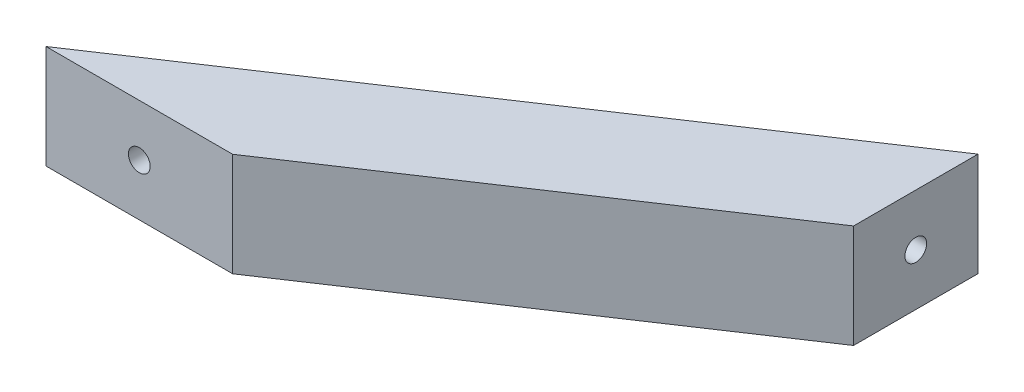
ISO-10303-21;
HEADER;
FILE_DESCRIPTION(('STEP AP214'),'2;1');
FILE_NAME('part.step','',(''),(''),'','','');
FILE_SCHEMA(('AUTOMOTIVE_DESIGN { 1 0 10303 214 1 1 1 1 }'));
ENDSEC;
DATA;
#1=APPLICATION_CONTEXT('core data for automotive mechanical design processes');
#2=APPLICATION_PROTOCOL_DEFINITION('international standard','automotive_design',2000,#1);
#3=PRODUCT_CONTEXT('',#1,'mechanical');
#4=PRODUCT('Part','Part','',(#3));
#5=PRODUCT_RELATED_PRODUCT_CATEGORY('part','',(#4));
#6=PRODUCT_DEFINITION_FORMATION('','',#4);
#7=PRODUCT_DEFINITION_CONTEXT('part definition',#1,'design');
#8=PRODUCT_DEFINITION('design','',#6,#7);
#9=PRODUCT_DEFINITION_SHAPE('','',#8);
#10=(LENGTH_UNIT() NAMED_UNIT(*) SI_UNIT(.MILLI.,.METRE.));
#11=(NAMED_UNIT(*) PLANE_ANGLE_UNIT() SI_UNIT($,.RADIAN.));
#12=(NAMED_UNIT(*) SI_UNIT($,.STERADIAN.) SOLID_ANGLE_UNIT());
#13=UNCERTAINTY_MEASURE_WITH_UNIT(LENGTH_MEASURE(1.E-05),#10,'distance_accuracy_value','');
#14=(GEOMETRIC_REPRESENTATION_CONTEXT(3) GLOBAL_UNCERTAINTY_ASSIGNED_CONTEXT((#13)) GLOBAL_UNIT_ASSIGNED_CONTEXT((#10,
#11,#12)) REPRESENTATION_CONTEXT('',''));
#15=CARTESIAN_POINT('',(0.,0.,0.));
#16=DIRECTION('',(0.,0.,1.));
#17=DIRECTION('',(1.,0.,0.));
#18=AXIS2_PLACEMENT_3D('',#15,#16,#17);
#19=CARTESIAN_POINT('',(90.,20.,0.));
#20=DIRECTION('',(1.,0.,0.));
#21=DIRECTION('',(0.,0.,-1.));
#22=AXIS2_PLACEMENT_3D('',#19,#20,#21);
#23=PLANE('',#22);
#24=CARTESIAN_POINT('',(90.,10.,-60.));
#25=DIRECTION('',(1.,0.,0.));
#26=DIRECTION('',(0.,0.,-1.));
#27=AXIS2_PLACEMENT_3D('',#24,#25,#26);
#28=CIRCLE('',#27,2.1);
#29=CARTESIAN_POINT('',(90.,10.,-62.1));
#30=VERTEX_POINT('',#29);
#31=EDGE_CURVE('E139',#30,#30,#28,.T.);
#32=ORIENTED_EDGE('',*,*,#31,.F.);
#33=EDGE_LOOP('',(#32));
#34=FACE_BOUND('',#33,.T.);
#35=DIRECTION('',(0.,0.,1.));
#36=VECTOR('',#35,1.);
#37=CARTESIAN_POINT('',(90.,0.,0.));
#38=LINE('',#37,#36);
#39=CARTESIAN_POINT('',(90.,0.,-72.0185042515466));
#40=VERTEX_POINT('',#39);
#41=CARTESIAN_POINT('',(90.,0.,-47.9814957484534));
#42=VERTEX_POINT('',#41);
#43=EDGE_CURVE('E114',#40,#42,#38,.T.);
#44=ORIENTED_EDGE('',*,*,#43,.F.);
#45=DIRECTION('',(0.,-1.,0.));
#46=VECTOR('',#45,1.);
#47=CARTESIAN_POINT('',(90.,20.,-72.0185042515466));
#48=LINE('',#47,#46);
#49=CARTESIAN_POINT('',(90.,20.,-72.0185042515466));
#50=VERTEX_POINT('',#49);
#51=EDGE_CURVE('E116',#50,#40,#48,.T.);
#52=ORIENTED_EDGE('',*,*,#51,.F.);
#53=DIRECTION('',(0.,0.,1.));
#54=VECTOR('',#53,1.);
#55=CARTESIAN_POINT('',(90.,20.,0.));
#56=LINE('',#55,#54);
#57=CARTESIAN_POINT('',(90.,20.,-47.9814957484534));
#58=VERTEX_POINT('',#57);
#59=EDGE_CURVE('E151',#50,#58,#56,.T.);
#60=ORIENTED_EDGE('',*,*,#59,.T.);
#61=DIRECTION('',(0.,-1.,0.));
#62=VECTOR('',#61,1.);
#63=CARTESIAN_POINT('',(90.,20.,-47.9814957484534));
#64=LINE('',#63,#62);
#65=EDGE_CURVE('E80',#58,#42,#64,.T.);
#66=ORIENTED_EDGE('',*,*,#65,.T.);
#67=EDGE_LOOP('',(#44,#52,#60,#66));
#68=FACE_BOUND('',#67,.T.);
#69=ADVANCED_FACE('F69',(#34,#68),#23,.T.);
#70=CARTESIAN_POINT('',(0.,0.,0.));
#71=DIRECTION('',(0.,1.,0.));
#72=DIRECTION('',(0.,0.,1.));
#73=AXIS2_PLACEMENT_3D('',#70,#71,#72);
#74=PLANE('',#73);
#75=ORIENTED_EDGE('',*,*,#43,.T.);
#76=DIRECTION('',(-0.832050294337844,0.,0.554700196225229));
#77=VECTOR('',#76,1.);
#78=CARTESIAN_POINT('',(5.5470019622523,0.,8.32050294337844));
#79=LINE('',#78,#77);
#80=CARTESIAN_POINT('',(18.02775637732,0.,0.));
#81=VERTEX_POINT('',#80);
#82=EDGE_CURVE('E155',#42,#81,#79,.T.);
#83=ORIENTED_EDGE('',*,*,#82,.T.);
#84=DIRECTION('',(1.,0.,0.));
#85=VECTOR('',#84,1.);
#86=CARTESIAN_POINT('',(0.,0.,0.));
#87=LINE('',#86,#85);
#88=CARTESIAN_POINT('',(-18.0277563773199,0.,0.));
#89=VERTEX_POINT('',#88);
#90=EDGE_CURVE('E108',#89,#81,#87,.T.);
#91=ORIENTED_EDGE('',*,*,#90,.F.);
#92=DIRECTION('',(-0.832050294337844,0.,0.554700196225229));
#93=VECTOR('',#92,1.);
#94=CARTESIAN_POINT('',(90.,0.,-72.0185042515466));
#95=LINE('',#94,#93);
#96=EDGE_CURVE('E124',#40,#89,#95,.T.);
#97=ORIENTED_EDGE('',*,*,#96,.F.);
#98=EDGE_LOOP('',(#75,#83,#91,#97));
#99=FACE_BOUND('',#98,.T.);
#100=ADVANCED_FACE('F129',(#99),#74,.F.);
#101=CARTESIAN_POINT('',(5.5470019622523,20.,8.32050294337844));
#102=DIRECTION('',(0.554700196225229,0.,0.832050294337844));
#103=DIRECTION('',(0.832050294337844,0.,-0.554700196225229));
#104=AXIS2_PLACEMENT_3D('',#101,#102,#103);
#105=PLANE('',#104);
#106=ORIENTED_EDGE('',*,*,#82,.F.);
#107=ORIENTED_EDGE('',*,*,#65,.F.);
#108=DIRECTION('',(-0.832050294337844,0.,0.554700196225229));
#109=VECTOR('',#108,1.);
#110=CARTESIAN_POINT('',(5.5470019622523,20.,8.32050294337844));
#111=LINE('',#110,#109);
#112=CARTESIAN_POINT('',(18.02775637732,20.,0.));
#113=VERTEX_POINT('',#112);
#114=EDGE_CURVE('E150',#58,#113,#111,.T.);
#115=ORIENTED_EDGE('',*,*,#114,.T.);
#116=DIRECTION('',(0.,-1.,0.));
#117=VECTOR('',#116,1.);
#118=CARTESIAN_POINT('',(18.02775637732,20.,0.));
#119=LINE('',#118,#117);
#120=EDGE_CURVE('E12',#113,#81,#119,.T.);
#121=ORIENTED_EDGE('',*,*,#120,.T.);
#122=EDGE_LOOP('',(#106,#107,#115,#121));
#123=FACE_BOUND('',#122,.T.);
#124=ADVANCED_FACE('F193',(#123),#105,.T.);
#125=CARTESIAN_POINT('',(0.,20.,0.));
#126=DIRECTION('',(0.,0.,-1.));
#127=DIRECTION('',(-1.,0.,0.));
#128=AXIS2_PLACEMENT_3D('',#125,#126,#127);
#129=PLANE('',#128);
#130=CARTESIAN_POINT('',(0.,10.,0.));
#131=DIRECTION('',(0.,0.,1.));
#132=DIRECTION('',(1.,0.,0.));
#133=AXIS2_PLACEMENT_3D('',#130,#131,#132);
#134=CIRCLE('',#133,2.1);
#135=CARTESIAN_POINT('',(2.10000000000002,10.,0.));
#136=VERTEX_POINT('',#135);
#137=EDGE_CURVE('E184',#136,#136,#134,.T.);
#138=ORIENTED_EDGE('',*,*,#137,.F.);
#139=EDGE_LOOP('',(#138));
#140=FACE_BOUND('',#139,.T.);
#141=ORIENTED_EDGE('',*,*,#90,.T.);
#142=ORIENTED_EDGE('',*,*,#120,.F.);
#143=DIRECTION('',(1.,0.,0.));
#144=VECTOR('',#143,1.);
#145=CARTESIAN_POINT('',(0.,20.,0.));
#146=LINE('',#145,#144);
#147=CARTESIAN_POINT('',(-18.0277563773199,20.,0.));
#148=VERTEX_POINT('',#147);
#149=EDGE_CURVE('E146',#148,#113,#146,.T.);
#150=ORIENTED_EDGE('',*,*,#149,.F.);
#151=DIRECTION('',(0.,-1.,0.));
#152=VECTOR('',#151,1.);
#153=CARTESIAN_POINT('',(-18.0277563773199,20.,0.));
#154=LINE('',#153,#152);
#155=EDGE_CURVE('E119',#148,#89,#154,.T.);
#156=ORIENTED_EDGE('',*,*,#155,.T.);
#157=EDGE_LOOP('',(#141,#142,#150,#156));
#158=FACE_BOUND('',#157,.T.);
#159=ADVANCED_FACE('F144',(#140,#158),#129,.F.);
#160=CARTESIAN_POINT('',(0.,20.,0.));
#161=DIRECTION('',(0.,1.,0.));
#162=DIRECTION('',(0.,0.,1.));
#163=AXIS2_PLACEMENT_3D('',#160,#161,#162);
#164=PLANE('',#163);
#165=ORIENTED_EDGE('',*,*,#59,.F.);
#166=DIRECTION('',(-0.832050294337844,0.,0.554700196225229));
#167=VECTOR('',#166,1.);
#168=CARTESIAN_POINT('',(90.,20.,-72.0185042515466));
#169=LINE('',#168,#167);
#170=EDGE_CURVE('E126',#50,#148,#169,.T.);
#171=ORIENTED_EDGE('',*,*,#170,.T.);
#172=ORIENTED_EDGE('',*,*,#149,.T.);
#173=ORIENTED_EDGE('',*,*,#114,.F.);
#174=EDGE_LOOP('',(#165,#171,#172,#173));
#175=FACE_BOUND('',#174,.T.);
#176=ADVANCED_FACE('F153',(#175),#164,.T.);
#177=CARTESIAN_POINT('',(90.,20.,-72.0185042515466));
#178=DIRECTION('',(0.554700196225229,0.,0.832050294337844));
#179=DIRECTION('',(0.832050294337844,0.,-0.554700196225229));
#180=AXIS2_PLACEMENT_3D('',#177,#178,#179);
#181=PLANE('',#180);
#182=CARTESIAN_POINT('',(0.,10.,-12.0185042515466));
#183=DIRECTION('',(0.554700196225229,0.,0.832050294337844));
#184=DIRECTION('',(-0.832050294337844,0.,0.554700196225229));
#185=AXIS2_PLACEMENT_3D('',#182,#183,#184);
#186=ELLIPSE('',#185,2.52388589282479,2.1);
#187=CARTESIAN_POINT('',(-2.09999999999998,10.,-10.6185042515466));
#188=VERTEX_POINT('',#187);
#189=EDGE_CURVE('E73',#188,#188,#186,.T.);
#190=ORIENTED_EDGE('',*,*,#189,.T.);
#191=EDGE_LOOP('',(#190));
#192=FACE_BOUND('',#191,.T.);
#193=CARTESIAN_POINT('',(71.9722436226801,10.,-60.));
#194=DIRECTION('',(0.554700196225229,0.,0.832050294337844));
#195=DIRECTION('',(0.832050294337844,0.,-0.554700196225229));
#196=AXIS2_PLACEMENT_3D('',#193,#194,#195);
#197=ELLIPSE('',#196,3.78582883923718,2.1);
#198=CARTESIAN_POINT('',(75.12224362268,10.,-62.1));
#199=VERTEX_POINT('',#198);
#200=EDGE_CURVE('E131',#199,#199,#197,.T.);
#201=ORIENTED_EDGE('',*,*,#200,.T.);
#202=EDGE_LOOP('',(#201));
#203=FACE_BOUND('',#202,.T.);
#204=ORIENTED_EDGE('',*,*,#96,.T.);
#205=ORIENTED_EDGE('',*,*,#155,.F.);
#206=ORIENTED_EDGE('',*,*,#170,.F.);
#207=ORIENTED_EDGE('',*,*,#51,.T.);
#208=EDGE_LOOP('',(#204,#205,#206,#207));
#209=FACE_BOUND('',#208,.T.);
#210=ADVANCED_FACE('F71',(#192,#203,#209),#181,.F.);
#211=CARTESIAN_POINT('',(-18.0277563773199,10.,-60.));
#212=DIRECTION('',(1.,0.,0.));
#213=DIRECTION('',(0.,0.,-1.));
#214=AXIS2_PLACEMENT_3D('',#211,#212,#213);
#215=CYLINDRICAL_SURFACE('',#214,2.1);
#216=ORIENTED_EDGE('',*,*,#31,.T.);
#217=EDGE_LOOP('',(#216));
#218=FACE_BOUND('',#217,.T.);
#219=ORIENTED_EDGE('',*,*,#200,.F.);
#220=EDGE_LOOP('',(#219));
#221=FACE_BOUND('',#220,.T.);
#222=ADVANCED_FACE('F208',(#218,#221),#215,.F.);
#223=CARTESIAN_POINT('',(0.,10.,-72.0185042515466));
#224=DIRECTION('',(0.,0.,1.));
#225=DIRECTION('',(1.,0.,0.));
#226=AXIS2_PLACEMENT_3D('',#223,#224,#225);
#227=CYLINDRICAL_SURFACE('',#226,2.1);
#228=ORIENTED_EDGE('',*,*,#137,.T.);
#229=EDGE_LOOP('',(#228));
#230=FACE_BOUND('',#229,.T.);
#231=ORIENTED_EDGE('',*,*,#189,.F.);
#232=EDGE_LOOP('',(#231));
#233=FACE_BOUND('',#232,.T.);
#234=ADVANCED_FACE('F189',(#230,#233),#227,.F.);
#235=CLOSED_SHELL('',(#69,#100,#124,#159,#176,#210,#222,#234));
#236=MANIFOLD_SOLID_BREP('B2',#235);
#237=ADVANCED_BREP_SHAPE_REPRESENTATION('',(#18,#236),#14);
#238=SHAPE_DEFINITION_REPRESENTATION(#9,#237);
ENDSEC;
END-ISO-10303-21;
